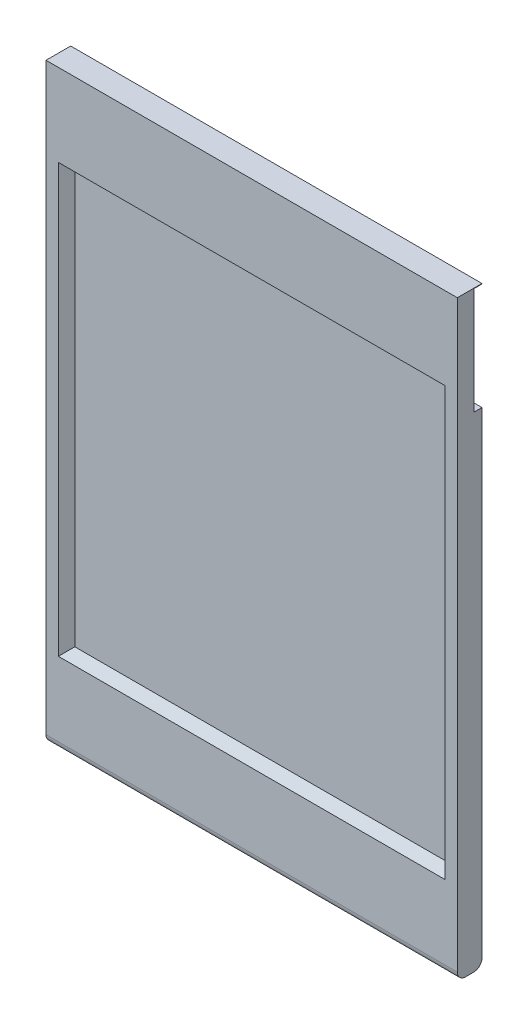
ISO-10303-21;
HEADER;
FILE_DESCRIPTION(('STEP AP214'),'2;1');
FILE_NAME('part.step','',(''),(''),'','','');
FILE_SCHEMA(('AUTOMOTIVE_DESIGN { 1 0 10303 214 1 1 1 1 }'));
ENDSEC;
DATA;
#1=APPLICATION_CONTEXT('core data for automotive mechanical design processes');
#2=APPLICATION_PROTOCOL_DEFINITION('international standard','automotive_design',2000,#1);
#3=PRODUCT_CONTEXT('',#1,'mechanical');
#4=PRODUCT('Part','Part','',(#3));
#5=PRODUCT_RELATED_PRODUCT_CATEGORY('part','',(#4));
#6=PRODUCT_DEFINITION_FORMATION('','',#4);
#7=PRODUCT_DEFINITION_CONTEXT('part definition',#1,'design');
#8=PRODUCT_DEFINITION('design','',#6,#7);
#9=PRODUCT_DEFINITION_SHAPE('','',#8);
#10=(LENGTH_UNIT() NAMED_UNIT(*) SI_UNIT(.MILLI.,.METRE.));
#11=(NAMED_UNIT(*) PLANE_ANGLE_UNIT() SI_UNIT($,.RADIAN.));
#12=(NAMED_UNIT(*) SI_UNIT($,.STERADIAN.) SOLID_ANGLE_UNIT());
#13=UNCERTAINTY_MEASURE_WITH_UNIT(LENGTH_MEASURE(1.E-05),#10,'distance_accuracy_value','');
#14=(GEOMETRIC_REPRESENTATION_CONTEXT(3) GLOBAL_UNCERTAINTY_ASSIGNED_CONTEXT((#13)) GLOBAL_UNIT_ASSIGNED_CONTEXT((#10,
#11,#12)) REPRESENTATION_CONTEXT('',''));
#15=CARTESIAN_POINT('',(0.,0.,0.));
#16=DIRECTION('',(0.,0.,1.));
#17=DIRECTION('',(1.,0.,0.));
#18=AXIS2_PLACEMENT_3D('',#15,#16,#17);
#19=CARTESIAN_POINT('',(250.,290.,7.));
#20=DIRECTION('',(0.,-1.,0.));
#21=DIRECTION('',(0.,0.,-1.));
#22=AXIS2_PLACEMENT_3D('',#19,#20,#21);
#23=PLANE('',#22);
#24=DIRECTION('',(0.,0.,1.));
#25=VECTOR('',#24,1.);
#26=CARTESIAN_POINT('',(230.,290.,7.));
#27=LINE('',#26,#25);
#28=CARTESIAN_POINT('',(230.,290.,0.));
#29=VERTEX_POINT('',#28);
#30=CARTESIAN_POINT('',(230.,290.,7.));
#31=VERTEX_POINT('',#30);
#32=EDGE_CURVE('E54',#29,#31,#27,.T.);
#33=ORIENTED_EDGE('',*,*,#32,.F.);
#34=DIRECTION('',(-1.,0.,0.));
#35=VECTOR('',#34,1.);
#36=CARTESIAN_POINT('',(250.,290.,0.));
#37=LINE('',#36,#35);
#38=CARTESIAN_POINT('',(-230.,290.,0.));
#39=VERTEX_POINT('',#38);
#40=EDGE_CURVE('E214',#29,#39,#37,.T.);
#41=ORIENTED_EDGE('',*,*,#40,.T.);
#42=DIRECTION('',(0.,0.,-1.));
#43=VECTOR('',#42,1.);
#44=CARTESIAN_POINT('',(-230.,290.,7.));
#45=LINE('',#44,#43);
#46=CARTESIAN_POINT('',(-230.,290.,7.));
#47=VERTEX_POINT('',#46);
#48=EDGE_CURVE('E229',#47,#39,#45,.T.);
#49=ORIENTED_EDGE('',*,*,#48,.F.);
#50=DIRECTION('',(-1.,0.,0.));
#51=VECTOR('',#50,1.);
#52=CARTESIAN_POINT('',(250.,290.,7.));
#53=LINE('',#52,#51);
#54=EDGE_CURVE('E218',#31,#47,#53,.T.);
#55=ORIENTED_EDGE('',*,*,#54,.F.);
#56=EDGE_LOOP('',(#33,#41,#49,#55));
#57=FACE_BOUND('',#56,.T.);
#58=ADVANCED_FACE('F38',(#57),#23,.F.);
#59=CARTESIAN_POINT('',(250.,310.,7.));
#60=DIRECTION('',(0.,1.,0.));
#61=DIRECTION('',(0.,0.,1.));
#62=AXIS2_PLACEMENT_3D('',#59,#60,#61);
#63=PLANE('',#62);
#64=DIRECTION('',(0.,0.,-1.));
#65=VECTOR('',#64,1.);
#66=CARTESIAN_POINT('',(230.,310.,7.));
#67=LINE('',#66,#65);
#68=CARTESIAN_POINT('',(230.,310.,7.));
#69=VERTEX_POINT('',#68);
#70=CARTESIAN_POINT('',(230.,310.,0.));
#71=VERTEX_POINT('',#70);
#72=EDGE_CURVE('E169',#69,#71,#67,.T.);
#73=ORIENTED_EDGE('',*,*,#72,.F.);
#74=DIRECTION('',(1.,0.,0.));
#75=VECTOR('',#74,1.);
#76=CARTESIAN_POINT('',(250.,310.,7.));
#77=LINE('',#76,#75);
#78=CARTESIAN_POINT('',(-230.,310.,7.));
#79=VERTEX_POINT('',#78);
#80=EDGE_CURVE('E213',#79,#69,#77,.T.);
#81=ORIENTED_EDGE('',*,*,#80,.F.);
#82=DIRECTION('',(0.,0.,-1.));
#83=VECTOR('',#82,1.);
#84=CARTESIAN_POINT('',(-230.,310.,7.));
#85=LINE('',#84,#83);
#86=CARTESIAN_POINT('',(-230.,310.,0.));
#87=VERTEX_POINT('',#86);
#88=EDGE_CURVE('E221',#79,#87,#85,.T.);
#89=ORIENTED_EDGE('',*,*,#88,.T.);
#90=DIRECTION('',(1.,0.,0.));
#91=VECTOR('',#90,1.);
#92=CARTESIAN_POINT('',(250.,310.,0.));
#93=LINE('',#92,#91);
#94=EDGE_CURVE('E224',#87,#71,#93,.T.);
#95=ORIENTED_EDGE('',*,*,#94,.T.);
#96=EDGE_LOOP('',(#73,#81,#89,#95));
#97=FACE_BOUND('',#96,.T.);
#98=ADVANCED_FACE('F376',(#97),#63,.F.);
#99=CARTESIAN_POINT('',(0.,0.,7.));
#100=DIRECTION('',(0.,0.,-1.));
#101=DIRECTION('',(-1.,0.,0.));
#102=AXIS2_PLACEMENT_3D('',#99,#100,#101);
#103=PLANE('',#102);
#104=ORIENTED_EDGE('',*,*,#80,.T.);
#105=DIRECTION('',(0.,-1.,0.));
#106=VECTOR('',#105,1.);
#107=CARTESIAN_POINT('',(230.,0.,7.));
#108=LINE('',#107,#106);
#109=EDGE_CURVE('E11',#69,#31,#108,.T.);
#110=ORIENTED_EDGE('',*,*,#109,.T.);
#111=ORIENTED_EDGE('',*,*,#54,.T.);
#112=DIRECTION('',(0.,1.,0.));
#113=VECTOR('',#112,1.);
#114=CARTESIAN_POINT('',(-230.,310.,7.));
#115=LINE('',#114,#113);
#116=EDGE_CURVE('E209',#47,#79,#115,.T.);
#117=ORIENTED_EDGE('',*,*,#116,.T.);
#118=EDGE_LOOP('',(#104,#110,#111,#117));
#119=FACE_BOUND('',#118,.T.);
#120=ADVANCED_FACE('F381',(#119),#103,.T.);
#121=CARTESIAN_POINT('',(-250.,-360.,30.));
#122=DIRECTION('',(1.,0.,0.));
#123=DIRECTION('',(0.,0.,-1.));
#124=AXIS2_PLACEMENT_3D('',#121,#122,#123);
#125=PLANE('',#124);
#126=DIRECTION('',(0.,-1.,0.));
#127=VECTOR('',#126,1.);
#128=CARTESIAN_POINT('',(-250.,-360.,0.));
#129=LINE('',#128,#127);
#130=CARTESIAN_POINT('',(-250.,360.,0.));
#131=VERTEX_POINT('',#130);
#132=CARTESIAN_POINT('',(-250.,-350.,0.));
#133=VERTEX_POINT('',#132);
#134=EDGE_CURVE('E250',#131,#133,#129,.T.);
#135=ORIENTED_EDGE('',*,*,#134,.T.);
#136=CARTESIAN_POINT('',(-250.,-350.,10.));
#137=DIRECTION('',(1.,0.,0.));
#138=DIRECTION('',(0.,0.,-1.));
#139=AXIS2_PLACEMENT_3D('',#136,#137,#138);
#140=CIRCLE('',#139,10.);
#141=CARTESIAN_POINT('',(-250.,-360.,10.));
#142=VERTEX_POINT('',#141);
#143=EDGE_CURVE('E47',#133,#142,#140,.F.);
#144=ORIENTED_EDGE('',*,*,#143,.T.);
#145=DIRECTION('',(0.,0.,-1.));
#146=VECTOR('',#145,1.);
#147=CARTESIAN_POINT('',(-250.,-360.,30.));
#148=LINE('',#147,#146);
#149=CARTESIAN_POINT('',(-250.,-360.,20.));
#150=VERTEX_POINT('',#149);
#151=EDGE_CURVE('E283',#150,#142,#148,.T.);
#152=ORIENTED_EDGE('',*,*,#151,.F.);
#153=CARTESIAN_POINT('',(-250.,-350.,20.));
#154=DIRECTION('',(1.,0.,0.));
#155=DIRECTION('',(0.,0.,-1.));
#156=AXIS2_PLACEMENT_3D('',#153,#154,#155);
#157=CIRCLE('',#156,10.);
#158=CARTESIAN_POINT('',(-250.,-350.,30.));
#159=VERTEX_POINT('',#158);
#160=EDGE_CURVE('E323',#150,#159,#157,.F.);
#161=ORIENTED_EDGE('',*,*,#160,.T.);
#162=DIRECTION('',(0.,-1.,0.));
#163=VECTOR('',#162,1.);
#164=CARTESIAN_POINT('',(-250.,-360.,30.));
#165=LINE('',#164,#163);
#166=CARTESIAN_POINT('',(-250.,360.,30.));
#167=VERTEX_POINT('',#166);
#168=EDGE_CURVE('E251',#167,#159,#165,.T.);
#169=ORIENTED_EDGE('',*,*,#168,.F.);
#170=DIRECTION('',(0.,0.,-1.));
#171=VECTOR('',#170,1.);
#172=CARTESIAN_POINT('',(-250.,360.,30.));
#173=LINE('',#172,#171);
#174=EDGE_CURVE('E262',#167,#131,#173,.T.);
#175=ORIENTED_EDGE('',*,*,#174,.T.);
#176=EDGE_LOOP('',(#135,#144,#152,#161,#169,#175));
#177=FACE_BOUND('',#176,.T.);
#178=ADVANCED_FACE('F339',(#177),#125,.F.);
#179=CARTESIAN_POINT('',(250.,-360.,30.));
#180=DIRECTION('',(0.,1.,0.));
#181=DIRECTION('',(-1.,0.,0.));
#182=AXIS2_PLACEMENT_3D('',#179,#180,#181);
#183=PLANE('',#182);
#184=ORIENTED_EDGE('',*,*,#151,.T.);
#185=DIRECTION('',(1.,0.,0.));
#186=VECTOR('',#185,1.);
#187=CARTESIAN_POINT('',(250.,-360.,10.));
#188=LINE('',#187,#186);
#189=CARTESIAN_POINT('',(250.,-360.,10.));
#190=VERTEX_POINT('',#189);
#191=EDGE_CURVE('E326',#142,#190,#188,.T.);
#192=ORIENTED_EDGE('',*,*,#191,.T.);
#193=DIRECTION('',(0.,0.,-1.));
#194=VECTOR('',#193,1.);
#195=CARTESIAN_POINT('',(250.,-360.,30.));
#196=LINE('',#195,#194);
#197=CARTESIAN_POINT('',(250.,-360.,20.));
#198=VERTEX_POINT('',#197);
#199=EDGE_CURVE('E279',#198,#190,#196,.T.);
#200=ORIENTED_EDGE('',*,*,#199,.F.);
#201=DIRECTION('',(1.,0.,0.));
#202=VECTOR('',#201,1.);
#203=CARTESIAN_POINT('',(-250.,-360.,20.));
#204=LINE('',#203,#202);
#205=EDGE_CURVE('E320',#198,#150,#204,.F.);
#206=ORIENTED_EDGE('',*,*,#205,.T.);
#207=EDGE_LOOP('',(#184,#192,#200,#206));
#208=FACE_BOUND('',#207,.T.);
#209=ADVANCED_FACE('F346',(#208),#183,.F.);
#210=CARTESIAN_POINT('',(250.,-360.,30.));
#211=DIRECTION('',(-1.,0.,0.));
#212=DIRECTION('',(0.,0.,1.));
#213=AXIS2_PLACEMENT_3D('',#210,#211,#212);
#214=PLANE('',#213);
#215=DIRECTION('',(0.,1.,0.));
#216=VECTOR('',#215,1.);
#217=CARTESIAN_POINT('',(250.,-360.,0.));
#218=LINE('',#217,#216);
#219=CARTESIAN_POINT('',(250.,-350.,0.));
#220=VERTEX_POINT('',#219);
#221=CARTESIAN_POINT('',(250.,229.429232032227,0.));
#222=VERTEX_POINT('',#221);
#223=EDGE_CURVE('E266',#220,#222,#218,.T.);
#224=ORIENTED_EDGE('',*,*,#223,.T.);
#225=DIRECTION('',(0.,0.,-1.));
#226=VECTOR('',#225,1.);
#227=CARTESIAN_POINT('',(250.,229.429232032227,10.));
#228=LINE('',#227,#226);
#229=CARTESIAN_POINT('',(250.,229.429232032227,10.));
#230=VERTEX_POINT('',#229);
#231=EDGE_CURVE('E176',#230,#222,#228,.T.);
#232=ORIENTED_EDGE('',*,*,#231,.F.);
#233=DIRECTION('',(0.,-1.,0.));
#234=VECTOR('',#233,1.);
#235=CARTESIAN_POINT('',(250.,359.429232032227,10.));
#236=LINE('',#235,#234);
#237=CARTESIAN_POINT('',(250.,359.429232032227,10.));
#238=VERTEX_POINT('',#237);
#239=EDGE_CURVE('E363',#238,#230,#236,.T.);
#240=ORIENTED_EDGE('',*,*,#239,.F.);
#241=DIRECTION('',(0.,0.,1.));
#242=VECTOR('',#241,1.);
#243=CARTESIAN_POINT('',(250.,359.429232032227,10.));
#244=LINE('',#243,#242);
#245=CARTESIAN_POINT('',(250.,359.429232032227,0.));
#246=VERTEX_POINT('',#245);
#247=EDGE_CURVE('E367',#246,#238,#244,.T.);
#248=ORIENTED_EDGE('',*,*,#247,.F.);
#249=CARTESIAN_POINT('',(250.,360.,0.));
#250=VERTEX_POINT('',#249);
#251=EDGE_CURVE('E192',#246,#250,#218,.T.);
#252=ORIENTED_EDGE('',*,*,#251,.T.);
#253=DIRECTION('',(0.,0.,-1.));
#254=VECTOR('',#253,1.);
#255=CARTESIAN_POINT('',(250.,360.,30.));
#256=LINE('',#255,#254);
#257=CARTESIAN_POINT('',(250.,360.,30.));
#258=VERTEX_POINT('',#257);
#259=EDGE_CURVE('E275',#258,#250,#256,.T.);
#260=ORIENTED_EDGE('',*,*,#259,.F.);
#261=DIRECTION('',(0.,1.,0.));
#262=VECTOR('',#261,1.);
#263=CARTESIAN_POINT('',(250.,-360.,30.));
#264=LINE('',#263,#262);
#265=CARTESIAN_POINT('',(250.,-350.,30.));
#266=VERTEX_POINT('',#265);
#267=EDGE_CURVE('E255',#266,#258,#264,.T.);
#268=ORIENTED_EDGE('',*,*,#267,.F.);
#269=CARTESIAN_POINT('',(250.,-350.,20.));
#270=DIRECTION('',(-1.,0.,0.));
#271=DIRECTION('',(0.,0.,1.));
#272=AXIS2_PLACEMENT_3D('',#269,#270,#271);
#273=CIRCLE('',#272,10.);
#274=EDGE_CURVE('E317',#266,#198,#273,.F.);
#275=ORIENTED_EDGE('',*,*,#274,.T.);
#276=ORIENTED_EDGE('',*,*,#199,.T.);
#277=CARTESIAN_POINT('',(250.,-350.,10.));
#278=DIRECTION('',(-1.,0.,0.));
#279=DIRECTION('',(0.,0.,1.));
#280=AXIS2_PLACEMENT_3D('',#277,#278,#279);
#281=CIRCLE('',#280,10.);
#282=EDGE_CURVE('E330',#190,#220,#281,.F.);
#283=ORIENTED_EDGE('',*,*,#282,.T.);
#284=EDGE_LOOP('',(#224,#232,#240,#248,#252,#260,#268,#275,#276,#283));
#285=FACE_BOUND('',#284,.T.);
#286=ADVANCED_FACE('F351',(#285),#214,.F.);
#287=CARTESIAN_POINT('',(250.,360.,30.));
#288=DIRECTION('',(0.,-1.,0.));
#289=DIRECTION('',(1.,0.,0.));
#290=AXIS2_PLACEMENT_3D('',#287,#288,#289);
#291=PLANE('',#290);
#292=DIRECTION('',(-1.,0.,0.));
#293=VECTOR('',#292,1.);
#294=CARTESIAN_POINT('',(250.,360.,0.));
#295=LINE('',#294,#293);
#296=EDGE_CURVE('E256',#250,#131,#295,.T.);
#297=ORIENTED_EDGE('',*,*,#296,.T.);
#298=ORIENTED_EDGE('',*,*,#174,.F.);
#299=DIRECTION('',(-1.,0.,0.));
#300=VECTOR('',#299,1.);
#301=CARTESIAN_POINT('',(250.,360.,30.));
#302=LINE('',#301,#300);
#303=EDGE_CURVE('E259',#258,#167,#302,.T.);
#304=ORIENTED_EDGE('',*,*,#303,.F.);
#305=ORIENTED_EDGE('',*,*,#259,.T.);
#306=EDGE_LOOP('',(#297,#298,#304,#305));
#307=FACE_BOUND('',#306,.T.);
#308=ADVANCED_FACE('F408',(#307),#291,.F.);
#309=CARTESIAN_POINT('',(0.,0.,30.));
#310=DIRECTION('',(0.,0.,1.));
#311=DIRECTION('',(1.,0.,0.));
#312=AXIS2_PLACEMENT_3D('',#309,#310,#311);
#313=PLANE('',#312);
#314=DIRECTION('',(1.,0.,0.));
#315=VECTOR('',#314,1.);
#316=CARTESIAN_POINT('',(225.,260.,30.));
#317=LINE('',#316,#315);
#318=CARTESIAN_POINT('',(-235.,260.,30.));
#319=VERTEX_POINT('',#318);
#320=CARTESIAN_POINT('',(235.,260.,30.));
#321=VERTEX_POINT('',#320);
#322=EDGE_CURVE('E287',#319,#321,#317,.T.);
#323=ORIENTED_EDGE('',*,*,#322,.T.);
#324=DIRECTION('',(0.,-1.,0.));
#325=VECTOR('',#324,1.);
#326=CARTESIAN_POINT('',(235.,-250.,30.));
#327=LINE('',#326,#325);
#328=CARTESIAN_POINT('',(235.,-260.,30.));
#329=VERTEX_POINT('',#328);
#330=EDGE_CURVE('E297',#321,#329,#327,.T.);
#331=ORIENTED_EDGE('',*,*,#330,.T.);
#332=DIRECTION('',(-1.,0.,0.));
#333=VECTOR('',#332,1.);
#334=CARTESIAN_POINT('',(-225.,-260.,30.));
#335=LINE('',#334,#333);
#336=CARTESIAN_POINT('',(-235.,-260.,30.));
#337=VERTEX_POINT('',#336);
#338=EDGE_CURVE('E294',#329,#337,#335,.T.);
#339=ORIENTED_EDGE('',*,*,#338,.T.);
#340=DIRECTION('',(0.,1.,0.));
#341=VECTOR('',#340,1.);
#342=CARTESIAN_POINT('',(-235.,260.,30.));
#343=LINE('',#342,#341);
#344=EDGE_CURVE('E290',#337,#319,#343,.T.);
#345=ORIENTED_EDGE('',*,*,#344,.T.);
#346=EDGE_LOOP('',(#323,#331,#339,#345));
#347=FACE_BOUND('',#346,.T.);
#348=ORIENTED_EDGE('',*,*,#168,.T.);
#349=DIRECTION('',(1.,0.,0.));
#350=VECTOR('',#349,1.);
#351=CARTESIAN_POINT('',(250.,-350.,30.));
#352=LINE('',#351,#350);
#353=EDGE_CURVE('E307',#159,#266,#352,.T.);
#354=ORIENTED_EDGE('',*,*,#353,.T.);
#355=ORIENTED_EDGE('',*,*,#267,.T.);
#356=ORIENTED_EDGE('',*,*,#303,.T.);
#357=EDGE_LOOP('',(#348,#354,#355,#356));
#358=FACE_BOUND('',#357,.T.);
#359=ADVANCED_FACE('F405',(#347,#358),#313,.T.);
#360=CARTESIAN_POINT('',(0.,0.,0.));
#361=DIRECTION('',(0.,0.,1.));
#362=DIRECTION('',(1.,0.,0.));
#363=AXIS2_PLACEMENT_3D('',#360,#361,#362);
#364=PLANE('',#363);
#365=DIRECTION('',(0.,1.,0.));
#366=VECTOR('',#365,1.);
#367=CARTESIAN_POINT('',(230.,359.429232032227,0.));
#368=LINE('',#367,#366);
#369=CARTESIAN_POINT('',(230.,229.429232032227,0.));
#370=VERTEX_POINT('',#369);
#371=EDGE_CURVE('E175',#370,#29,#368,.T.);
#372=ORIENTED_EDGE('',*,*,#371,.F.);
#373=DIRECTION('',(1.,0.,0.));
#374=VECTOR('',#373,1.);
#375=CARTESIAN_POINT('',(230.,229.429232032227,0.));
#376=LINE('',#375,#374);
#377=EDGE_CURVE('E206',#370,#222,#376,.T.);
#378=ORIENTED_EDGE('',*,*,#377,.T.);
#379=ORIENTED_EDGE('',*,*,#223,.F.);
#380=DIRECTION('',(1.,0.,0.));
#381=VECTOR('',#380,1.);
#382=CARTESIAN_POINT('',(0.,-350.,0.));
#383=LINE('',#382,#381);
#384=EDGE_CURVE('E333',#220,#133,#383,.F.);
#385=ORIENTED_EDGE('',*,*,#384,.T.);
#386=ORIENTED_EDGE('',*,*,#134,.F.);
#387=ORIENTED_EDGE('',*,*,#296,.F.);
#388=ORIENTED_EDGE('',*,*,#251,.F.);
#389=DIRECTION('',(1.,0.,0.));
#390=VECTOR('',#389,1.);
#391=CARTESIAN_POINT('',(230.,359.429232032227,0.));
#392=LINE('',#391,#390);
#393=CARTESIAN_POINT('',(230.,359.429232032227,0.));
#394=VERTEX_POINT('',#393);
#395=EDGE_CURVE('E181',#394,#246,#392,.T.);
#396=ORIENTED_EDGE('',*,*,#395,.F.);
#397=EDGE_CURVE('E163',#71,#394,#368,.T.);
#398=ORIENTED_EDGE('',*,*,#397,.F.);
#399=ORIENTED_EDGE('',*,*,#94,.F.);
#400=DIRECTION('',(0.,1.,0.));
#401=VECTOR('',#400,1.);
#402=CARTESIAN_POINT('',(-230.,310.,0.));
#403=LINE('',#402,#401);
#404=EDGE_CURVE('E61',#39,#87,#403,.T.);
#405=ORIENTED_EDGE('',*,*,#404,.F.);
#406=ORIENTED_EDGE('',*,*,#40,.F.);
#407=EDGE_LOOP('',(#372,#378,#379,#385,#386,#387,#388,#396,#398,#399,#405,#406));
#408=FACE_BOUND('',#407,.T.);
#409=ADVANCED_FACE('F190',(#408),#364,.F.);
#410=CARTESIAN_POINT('',(0.,0.,20.));
#411=DIRECTION('',(0.,0.,1.));
#412=DIRECTION('',(1.,0.,0.));
#413=AXIS2_PLACEMENT_3D('',#410,#411,#412);
#414=PLANE('',#413);
#415=DIRECTION('',(0.,-1.,0.));
#416=VECTOR('',#415,1.);
#417=CARTESIAN_POINT('',(-225.,-250.,20.));
#418=LINE('',#417,#416);
#419=CARTESIAN_POINT('',(-225.,250.,20.));
#420=VERTEX_POINT('',#419);
#421=CARTESIAN_POINT('',(-225.,-250.,20.));
#422=VERTEX_POINT('',#421);
#423=EDGE_CURVE('E235',#420,#422,#418,.T.);
#424=ORIENTED_EDGE('',*,*,#423,.T.);
#425=DIRECTION('',(1.,0.,0.));
#426=VECTOR('',#425,1.);
#427=CARTESIAN_POINT('',(225.,-250.,20.));
#428=LINE('',#427,#426);
#429=CARTESIAN_POINT('',(225.,-250.,20.));
#430=VERTEX_POINT('',#429);
#431=EDGE_CURVE('E238',#422,#430,#428,.T.);
#432=ORIENTED_EDGE('',*,*,#431,.T.);
#433=DIRECTION('',(0.,1.,0.));
#434=VECTOR('',#433,1.);
#435=CARTESIAN_POINT('',(225.,-250.,20.));
#436=LINE('',#435,#434);
#437=CARTESIAN_POINT('',(225.,250.,20.));
#438=VERTEX_POINT('',#437);
#439=EDGE_CURVE('E242',#430,#438,#436,.T.);
#440=ORIENTED_EDGE('',*,*,#439,.T.);
#441=DIRECTION('',(-1.,0.,0.));
#442=VECTOR('',#441,1.);
#443=CARTESIAN_POINT('',(225.,250.,20.));
#444=LINE('',#443,#442);
#445=EDGE_CURVE('E246',#438,#420,#444,.T.);
#446=ORIENTED_EDGE('',*,*,#445,.T.);
#447=EDGE_LOOP('',(#424,#432,#440,#446));
#448=FACE_BOUND('',#447,.T.);
#449=ADVANCED_FACE('F400',(#448),#414,.T.);
#450=CARTESIAN_POINT('',(225.,250.,20.));
#451=DIRECTION('',(0.,-0.707106781186543,0.707106781186552));
#452=DIRECTION('',(1.,0.,0.));
#453=AXIS2_PLACEMENT_3D('',#450,#451,#452);
#454=PLANE('',#453);
#455=ORIENTED_EDGE('',*,*,#445,.F.);
#456=DIRECTION('',(0.577350269189627,0.577350269189629,0.577350269189621));
#457=VECTOR('',#456,1.);
#458=CARTESIAN_POINT('',(58.3333333333319,83.3333333333315,-146.666666666666));
#459=LINE('',#458,#457);
#460=EDGE_CURVE('E300',#438,#321,#459,.T.);
#461=ORIENTED_EDGE('',*,*,#460,.T.);
#462=ORIENTED_EDGE('',*,*,#322,.F.);
#463=DIRECTION('',(0.577350269189627,-0.577350269189629,-0.577350269189621));
#464=VECTOR('',#463,1.);
#465=CARTESIAN_POINT('',(-58.3333333333319,83.3333333333315,-146.666666666666));
#466=LINE('',#465,#464);
#467=EDGE_CURVE('E304',#319,#420,#466,.T.);
#468=ORIENTED_EDGE('',*,*,#467,.T.);
#469=EDGE_LOOP('',(#455,#461,#462,#468));
#470=FACE_BOUND('',#469,.T.);
#471=ADVANCED_FACE('F403',(#470),#454,.T.);
#472=CARTESIAN_POINT('',(-225.,-250.,20.));
#473=DIRECTION('',(0.707106781186543,0.,0.707106781186551));
#474=DIRECTION('',(0.,1.,0.));
#475=AXIS2_PLACEMENT_3D('',#472,#473,#474);
#476=PLANE('',#475);
#477=ORIENTED_EDGE('',*,*,#467,.F.);
#478=ORIENTED_EDGE('',*,*,#344,.F.);
#479=DIRECTION('',(0.577350269189628,0.577350269189628,-0.577350269189622));
#480=VECTOR('',#479,1.);
#481=CARTESIAN_POINT('',(-74.9999999999989,-99.9999999999989,-129.999999999999));
#482=LINE('',#481,#480);
#483=EDGE_CURVE('E239',#422,#337,#482,.F.);
#484=ORIENTED_EDGE('',*,*,#483,.F.);
#485=ORIENTED_EDGE('',*,*,#423,.F.);
#486=EDGE_LOOP('',(#477,#478,#484,#485));
#487=FACE_BOUND('',#486,.T.);
#488=ADVANCED_FACE('F420',(#487),#476,.T.);
#489=CARTESIAN_POINT('',(225.,-250.,20.));
#490=DIRECTION('',(0.,0.707106781186543,0.707106781186551));
#491=DIRECTION('',(-1.,0.,0.));
#492=AXIS2_PLACEMENT_3D('',#489,#490,#491);
#493=PLANE('',#492);
#494=ORIENTED_EDGE('',*,*,#483,.T.);
#495=ORIENTED_EDGE('',*,*,#338,.F.);
#496=DIRECTION('',(-0.577350269189628,0.577350269189628,-0.577350269189622));
#497=VECTOR('',#496,1.);
#498=CARTESIAN_POINT('',(225.,-250.,20.));
#499=LINE('',#498,#497);
#500=EDGE_CURVE('E232',#430,#329,#499,.F.);
#501=ORIENTED_EDGE('',*,*,#500,.F.);
#502=ORIENTED_EDGE('',*,*,#431,.F.);
#503=EDGE_LOOP('',(#494,#495,#501,#502));
#504=FACE_BOUND('',#503,.T.);
#505=ADVANCED_FACE('F426',(#504),#493,.T.);
#506=CARTESIAN_POINT('',(225.,-250.,20.));
#507=DIRECTION('',(-0.707106781186543,0.,0.707106781186551));
#508=DIRECTION('',(0.,-1.,0.));
#509=AXIS2_PLACEMENT_3D('',#506,#507,#508);
#510=PLANE('',#509);
#511=ORIENTED_EDGE('',*,*,#500,.T.);
#512=ORIENTED_EDGE('',*,*,#330,.F.);
#513=ORIENTED_EDGE('',*,*,#460,.F.);
#514=ORIENTED_EDGE('',*,*,#439,.F.);
#515=EDGE_LOOP('',(#511,#512,#513,#514));
#516=FACE_BOUND('',#515,.T.);
#517=ADVANCED_FACE('F422',(#516),#510,.T.);
#518=CARTESIAN_POINT('',(0.,-350.,20.));
#519=DIRECTION('',(-1.,0.,0.));
#520=DIRECTION('',(0.,-1.,0.));
#521=AXIS2_PLACEMENT_3D('',#518,#519,#520);
#522=CYLINDRICAL_SURFACE('',#521,10.);
#523=ORIENTED_EDGE('',*,*,#160,.F.);
#524=ORIENTED_EDGE('',*,*,#205,.F.);
#525=ORIENTED_EDGE('',*,*,#274,.F.);
#526=ORIENTED_EDGE('',*,*,#353,.F.);
#527=EDGE_LOOP('',(#523,#524,#525,#526));
#528=FACE_BOUND('',#527,.T.);
#529=ADVANCED_FACE('F425',(#528),#522,.T.);
#530=CARTESIAN_POINT('',(250.,-350.,10.));
#531=DIRECTION('',(1.,0.,0.));
#532=DIRECTION('',(0.,1.,0.));
#533=AXIS2_PLACEMENT_3D('',#530,#531,#532);
#534=CYLINDRICAL_SURFACE('',#533,10.);
#535=ORIENTED_EDGE('',*,*,#143,.F.);
#536=ORIENTED_EDGE('',*,*,#384,.F.);
#537=ORIENTED_EDGE('',*,*,#282,.F.);
#538=ORIENTED_EDGE('',*,*,#191,.F.);
#539=EDGE_LOOP('',(#535,#536,#537,#538));
#540=FACE_BOUND('',#539,.T.);
#541=ADVANCED_FACE('F40',(#540),#534,.T.);
#542=CARTESIAN_POINT('',(-230.,310.,7.));
#543=DIRECTION('',(-1.,0.,0.));
#544=DIRECTION('',(0.,-1.,0.));
#545=AXIS2_PLACEMENT_3D('',#542,#543,#544);
#546=PLANE('',#545);
#547=ORIENTED_EDGE('',*,*,#404,.T.);
#548=ORIENTED_EDGE('',*,*,#88,.F.);
#549=ORIENTED_EDGE('',*,*,#116,.F.);
#550=ORIENTED_EDGE('',*,*,#48,.T.);
#551=EDGE_LOOP('',(#547,#548,#549,#550));
#552=FACE_BOUND('',#551,.T.);
#553=ADVANCED_FACE('F379',(#552),#546,.F.);
#554=CARTESIAN_POINT('',(230.,0.,0.));
#555=DIRECTION('',(1.,0.,0.));
#556=DIRECTION('',(0.,0.,-1.));
#557=AXIS2_PLACEMENT_3D('',#554,#555,#556);
#558=PLANE('',#557);
#559=ORIENTED_EDGE('',*,*,#32,.T.);
#560=ORIENTED_EDGE('',*,*,#109,.F.);
#561=ORIENTED_EDGE('',*,*,#72,.T.);
#562=ORIENTED_EDGE('',*,*,#397,.T.);
#563=DIRECTION('',(0.,0.,1.));
#564=VECTOR('',#563,1.);
#565=CARTESIAN_POINT('',(230.,359.429232032227,10.));
#566=LINE('',#565,#564);
#567=CARTESIAN_POINT('',(230.,359.429232032227,10.));
#568=VERTEX_POINT('',#567);
#569=EDGE_CURVE('E167',#394,#568,#566,.T.);
#570=ORIENTED_EDGE('',*,*,#569,.T.);
#571=DIRECTION('',(0.,-1.,0.));
#572=VECTOR('',#571,1.);
#573=CARTESIAN_POINT('',(230.,359.429232032227,10.));
#574=LINE('',#573,#572);
#575=CARTESIAN_POINT('',(230.,229.429232032227,10.));
#576=VERTEX_POINT('',#575);
#577=EDGE_CURVE('E186',#568,#576,#574,.T.);
#578=ORIENTED_EDGE('',*,*,#577,.T.);
#579=DIRECTION('',(0.,0.,-1.));
#580=VECTOR('',#579,1.);
#581=CARTESIAN_POINT('',(230.,229.429232032227,10.));
#582=LINE('',#581,#580);
#583=EDGE_CURVE('E194',#576,#370,#582,.T.);
#584=ORIENTED_EDGE('',*,*,#583,.T.);
#585=ORIENTED_EDGE('',*,*,#371,.T.);
#586=EDGE_LOOP('',(#559,#560,#561,#562,#570,#578,#584,#585));
#587=FACE_BOUND('',#586,.T.);
#588=ADVANCED_FACE('F165',(#587),#558,.T.);
#589=CARTESIAN_POINT('',(230.,229.429232032227,10.));
#590=DIRECTION('',(0.,-1.,0.));
#591=DIRECTION('',(0.,0.,-1.));
#592=AXIS2_PLACEMENT_3D('',#589,#590,#591);
#593=PLANE('',#592);
#594=ORIENTED_EDGE('',*,*,#231,.T.);
#595=ORIENTED_EDGE('',*,*,#377,.F.);
#596=ORIENTED_EDGE('',*,*,#583,.F.);
#597=DIRECTION('',(1.,0.,0.));
#598=VECTOR('',#597,1.);
#599=CARTESIAN_POINT('',(230.,229.429232032227,10.));
#600=LINE('',#599,#598);
#601=EDGE_CURVE('E198',#576,#230,#600,.T.);
#602=ORIENTED_EDGE('',*,*,#601,.T.);
#603=EDGE_LOOP('',(#594,#595,#596,#602));
#604=FACE_BOUND('',#603,.T.);
#605=ADVANCED_FACE('F449',(#604),#593,.F.);
#606=CARTESIAN_POINT('',(230.,359.429232032227,10.));
#607=DIRECTION('',(0.,0.,1.));
#608=DIRECTION('',(0.,-1.,0.));
#609=AXIS2_PLACEMENT_3D('',#606,#607,#608);
#610=PLANE('',#609);
#611=ORIENTED_EDGE('',*,*,#239,.T.);
#612=ORIENTED_EDGE('',*,*,#601,.F.);
#613=ORIENTED_EDGE('',*,*,#577,.F.);
#614=DIRECTION('',(1.,0.,0.));
#615=VECTOR('',#614,1.);
#616=CARTESIAN_POINT('',(230.,359.429232032227,10.));
#617=LINE('',#616,#615);
#618=EDGE_CURVE('E183',#568,#238,#617,.T.);
#619=ORIENTED_EDGE('',*,*,#618,.T.);
#620=EDGE_LOOP('',(#611,#612,#613,#619));
#621=FACE_BOUND('',#620,.T.);
#622=ADVANCED_FACE('F448',(#621),#610,.F.);
#623=CARTESIAN_POINT('',(230.,359.429232032227,10.));
#624=DIRECTION('',(0.,1.,0.));
#625=DIRECTION('',(0.,0.,1.));
#626=AXIS2_PLACEMENT_3D('',#623,#624,#625);
#627=PLANE('',#626);
#628=ORIENTED_EDGE('',*,*,#247,.T.);
#629=ORIENTED_EDGE('',*,*,#618,.F.);
#630=ORIENTED_EDGE('',*,*,#569,.F.);
#631=ORIENTED_EDGE('',*,*,#395,.T.);
#632=EDGE_LOOP('',(#628,#629,#630,#631));
#633=FACE_BOUND('',#632,.T.);
#634=ADVANCED_FACE('F180',(#633),#627,.F.);
#635=CLOSED_SHELL('',(#58,#98,#120,#178,#209,#286,#308,#359,#409,#449,#471,#488,#505,#517,#529,
#541,#553,#588,#605,#622,#634));
#636=MANIFOLD_SOLID_BREP('B2',#635);
#637=ADVANCED_BREP_SHAPE_REPRESENTATION('',(#18,#636),#14);
#638=SHAPE_DEFINITION_REPRESENTATION(#9,#637);
ENDSEC;
END-ISO-10303-21;
